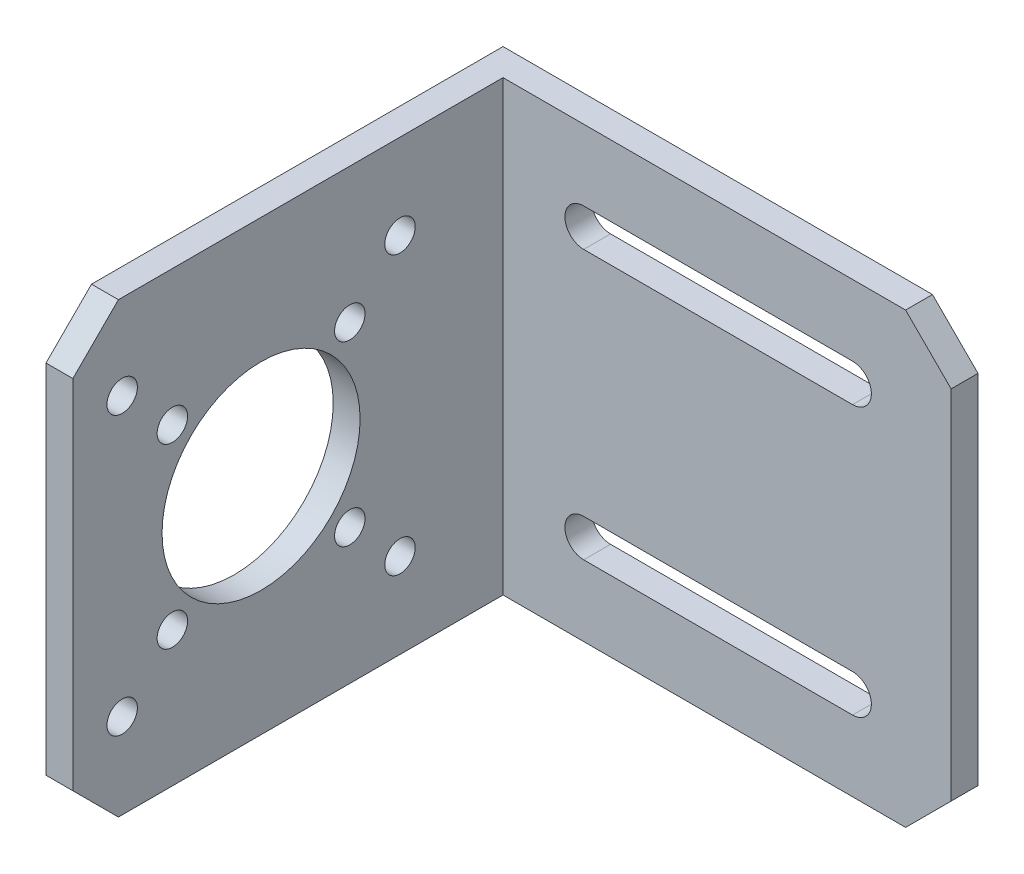
ISO-10303-21;
HEADER;
FILE_DESCRIPTION(('STEP AP214'),'2;1');
FILE_NAME('part.step','',(''),(''),'','','');
FILE_SCHEMA(('AUTOMOTIVE_DESIGN { 1 0 10303 214 1 1 1 1 }'));
ENDSEC;
DATA;
#1=APPLICATION_CONTEXT('core data for automotive mechanical design processes');
#2=APPLICATION_PROTOCOL_DEFINITION('international standard','automotive_design',2000,#1);
#3=PRODUCT_CONTEXT('',#1,'mechanical');
#4=PRODUCT('Part','Part','',(#3));
#5=PRODUCT_RELATED_PRODUCT_CATEGORY('part','',(#4));
#6=PRODUCT_DEFINITION_FORMATION('','',#4);
#7=PRODUCT_DEFINITION_CONTEXT('part definition',#1,'design');
#8=PRODUCT_DEFINITION('design','',#6,#7);
#9=PRODUCT_DEFINITION_SHAPE('','',#8);
#10=(LENGTH_UNIT() NAMED_UNIT(*) SI_UNIT(.MILLI.,.METRE.));
#11=(NAMED_UNIT(*) PLANE_ANGLE_UNIT() SI_UNIT($,.RADIAN.));
#12=(NAMED_UNIT(*) SI_UNIT($,.STERADIAN.) SOLID_ANGLE_UNIT());
#13=UNCERTAINTY_MEASURE_WITH_UNIT(LENGTH_MEASURE(1.E-05),#10,'distance_accuracy_value','');
#14=(GEOMETRIC_REPRESENTATION_CONTEXT(3) GLOBAL_UNCERTAINTY_ASSIGNED_CONTEXT((#13)) GLOBAL_UNIT_ASSIGNED_CONTEXT((#10,
#11,#12)) REPRESENTATION_CONTEXT('',''));
#15=CARTESIAN_POINT('',(0.,0.,0.));
#16=DIRECTION('',(0.,0.,1.));
#17=DIRECTION('',(1.,0.,0.));
#18=AXIS2_PLACEMENT_3D('',#15,#16,#17);
#19=CARTESIAN_POINT('',(0.,0.,3.));
#20=DIRECTION('',(0.,0.,-1.));
#21=DIRECTION('',(-1.,0.,0.));
#22=AXIS2_PLACEMENT_3D('',#19,#20,#21);
#23=PLANE('',#22);
#24=DIRECTION('',(-1.,0.,0.));
#25=VECTOR('',#24,1.);
#26=CARTESIAN_POINT('',(42.,42.1,3.));
#27=LINE('',#26,#25);
#28=CARTESIAN_POINT('',(42.,42.1,3.));
#29=VERTEX_POINT('',#28);
#30=CARTESIAN_POINT('',(12.,42.1,3.));
#31=VERTEX_POINT('',#30);
#32=EDGE_CURVE('E243',#29,#31,#27,.T.);
#33=ORIENTED_EDGE('',*,*,#32,.F.);
#34=CARTESIAN_POINT('',(42.,40.,3.));
#35=DIRECTION('',(0.,0.,1.));
#36=DIRECTION('',(1.,0.,0.));
#37=AXIS2_PLACEMENT_3D('',#34,#35,#36);
#38=CIRCLE('',#37,2.09999999999999);
#39=CARTESIAN_POINT('',(42.,37.9,3.));
#40=VERTEX_POINT('',#39);
#41=EDGE_CURVE('E221',#40,#29,#38,.T.);
#42=ORIENTED_EDGE('',*,*,#41,.F.);
#43=DIRECTION('',(1.,0.,0.));
#44=VECTOR('',#43,1.);
#45=CARTESIAN_POINT('',(42.,37.9,3.));
#46=LINE('',#45,#44);
#47=CARTESIAN_POINT('',(12.,37.9,3.));
#48=VERTEX_POINT('',#47);
#49=EDGE_CURVE('E232',#48,#40,#46,.T.);
#50=ORIENTED_EDGE('',*,*,#49,.F.);
#51=CARTESIAN_POINT('',(12.,40.,3.));
#52=DIRECTION('',(0.,0.,1.));
#53=DIRECTION('',(1.,0.,0.));
#54=AXIS2_PLACEMENT_3D('',#51,#52,#53);
#55=CIRCLE('',#54,2.09999999999999);
#56=EDGE_CURVE('E246',#31,#48,#55,.T.);
#57=ORIENTED_EDGE('',*,*,#56,.F.);
#58=EDGE_LOOP('',(#33,#42,#50,#57));
#59=FACE_BOUND('',#58,.T.);
#60=DIRECTION('',(-1.,0.,0.));
#61=VECTOR('',#60,1.);
#62=CARTESIAN_POINT('',(42.,12.1,3.));
#63=LINE('',#62,#61);
#64=CARTESIAN_POINT('',(42.,12.1,3.));
#65=VERTEX_POINT('',#64);
#66=CARTESIAN_POINT('',(12.,12.1,3.));
#67=VERTEX_POINT('',#66);
#68=EDGE_CURVE('E211',#65,#67,#63,.T.);
#69=ORIENTED_EDGE('',*,*,#68,.F.);
#70=CARTESIAN_POINT('',(42.,10.,3.));
#71=DIRECTION('',(0.,0.,1.));
#72=DIRECTION('',(-1.,0.,0.));
#73=AXIS2_PLACEMENT_3D('',#70,#71,#72);
#74=CIRCLE('',#73,2.09999999999999);
#75=CARTESIAN_POINT('',(42.,7.90000000000002,3.));
#76=VERTEX_POINT('',#75);
#77=EDGE_CURVE('E195',#76,#65,#74,.T.);
#78=ORIENTED_EDGE('',*,*,#77,.F.);
#79=DIRECTION('',(1.,0.,0.));
#80=VECTOR('',#79,1.);
#81=CARTESIAN_POINT('',(42.,7.90000000000002,3.));
#82=LINE('',#81,#80);
#83=CARTESIAN_POINT('',(12.,7.90000000000001,3.));
#84=VERTEX_POINT('',#83);
#85=EDGE_CURVE('E200',#84,#76,#82,.T.);
#86=ORIENTED_EDGE('',*,*,#85,.F.);
#87=CARTESIAN_POINT('',(12.,10.,3.));
#88=DIRECTION('',(0.,0.,1.));
#89=DIRECTION('',(-1.,0.,0.));
#90=AXIS2_PLACEMENT_3D('',#87,#88,#89);
#91=CIRCLE('',#90,2.09999999999999);
#92=EDGE_CURVE('E214',#67,#84,#91,.T.);
#93=ORIENTED_EDGE('',*,*,#92,.F.);
#94=EDGE_LOOP('',(#69,#78,#86,#93));
#95=FACE_BOUND('',#94,.T.);
#96=DIRECTION('',(1.,0.,0.));
#97=VECTOR('',#96,1.);
#98=CARTESIAN_POINT('',(0.,0.,3.));
#99=LINE('',#98,#97);
#100=CARTESIAN_POINT('',(3.,0.,3.));
#101=VERTEX_POINT('',#100);
#102=CARTESIAN_POINT('',(47.92,0.,3.));
#103=VERTEX_POINT('',#102);
#104=EDGE_CURVE('E260',#101,#103,#99,.T.);
#105=ORIENTED_EDGE('',*,*,#104,.T.);
#106=DIRECTION('',(-0.707106781186548,-0.707106781186547,0.));
#107=VECTOR('',#106,1.);
#108=CARTESIAN_POINT('',(53.,5.08,3.));
#109=LINE('',#108,#107);
#110=CARTESIAN_POINT('',(53.,5.08,3.));
#111=VERTEX_POINT('',#110);
#112=EDGE_CURVE('E11',#103,#111,#109,.F.);
#113=ORIENTED_EDGE('',*,*,#112,.T.);
#114=DIRECTION('',(0.,1.,0.));
#115=VECTOR('',#114,1.);
#116=CARTESIAN_POINT('',(53.,0.,3.));
#117=LINE('',#116,#115);
#118=CARTESIAN_POINT('',(53.,44.92,3.));
#119=VERTEX_POINT('',#118);
#120=EDGE_CURVE('E169',#111,#119,#117,.T.);
#121=ORIENTED_EDGE('',*,*,#120,.T.);
#122=DIRECTION('',(0.707106781186546,-0.70710678118655,0.));
#123=VECTOR('',#122,1.);
#124=CARTESIAN_POINT('',(47.92,50.,3.));
#125=LINE('',#124,#123);
#126=CARTESIAN_POINT('',(47.92,50.,3.));
#127=VERTEX_POINT('',#126);
#128=EDGE_CURVE('E43',#119,#127,#125,.F.);
#129=ORIENTED_EDGE('',*,*,#128,.T.);
#130=DIRECTION('',(-1.,0.,0.));
#131=VECTOR('',#130,1.);
#132=CARTESIAN_POINT('',(0.,50.,3.));
#133=LINE('',#132,#131);
#134=CARTESIAN_POINT('',(3.,50.,3.));
#135=VERTEX_POINT('',#134);
#136=EDGE_CURVE('E159',#127,#135,#133,.T.);
#137=ORIENTED_EDGE('',*,*,#136,.T.);
#138=DIRECTION('',(0.,1.,0.));
#139=VECTOR('',#138,1.);
#140=CARTESIAN_POINT('',(3.,50.,3.));
#141=LINE('',#140,#139);
#142=EDGE_CURVE('E162',#101,#135,#141,.T.);
#143=ORIENTED_EDGE('',*,*,#142,.F.);
#144=EDGE_LOOP('',(#105,#113,#121,#129,#137,#143));
#145=FACE_BOUND('',#144,.T.);
#146=ADVANCED_FACE('F35',(#59,#95,#145),#23,.F.);
#147=CARTESIAN_POINT('',(0.,0.,3.));
#148=DIRECTION('',(1.,0.,0.));
#149=DIRECTION('',(0.,0.,-1.));
#150=AXIS2_PLACEMENT_3D('',#147,#148,#149);
#151=PLANE('',#150);
#152=CARTESIAN_POINT('',(0.,15.1005050633883,39.8994949366117));
#153=DIRECTION('',(-1.,0.,0.));
#154=DIRECTION('',(0.,0.,1.));
#155=AXIS2_PLACEMENT_3D('',#152,#153,#154);
#156=CIRCLE('',#155,1.69999999999999);
#157=CARTESIAN_POINT('',(0.,15.1005050633883,41.5994949366116));
#158=VERTEX_POINT('',#157);
#159=EDGE_CURVE('E684',#158,#158,#156,.T.);
#160=ORIENTED_EDGE('',*,*,#159,.F.);
#161=EDGE_LOOP('',(#160));
#162=FACE_BOUND('',#161,.T.);
#163=CARTESIAN_POINT('',(0.,34.8994949366117,20.1005050633883));
#164=DIRECTION('',(-1.,0.,0.));
#165=DIRECTION('',(0.,0.,1.));
#166=AXIS2_PLACEMENT_3D('',#163,#164,#165);
#167=CIRCLE('',#166,1.69999999999999);
#168=CARTESIAN_POINT('',(0.,34.8994949366117,21.8005050633883));
#169=VERTEX_POINT('',#168);
#170=EDGE_CURVE('E688',#169,#169,#167,.T.);
#171=ORIENTED_EDGE('',*,*,#170,.F.);
#172=EDGE_LOOP('',(#171));
#173=FACE_BOUND('',#172,.T.);
#174=CARTESIAN_POINT('',(0.,15.1005050633883,20.1005050633883));
#175=DIRECTION('',(-1.,0.,0.));
#176=DIRECTION('',(0.,0.,1.));
#177=AXIS2_PLACEMENT_3D('',#174,#175,#176);
#178=CIRCLE('',#177,1.69999999999999);
#179=CARTESIAN_POINT('',(0.,15.1005050633883,21.8005050633883));
#180=VERTEX_POINT('',#179);
#181=EDGE_CURVE('E697',#180,#180,#178,.T.);
#182=ORIENTED_EDGE('',*,*,#181,.F.);
#183=EDGE_LOOP('',(#182));
#184=FACE_BOUND('',#183,.T.);
#185=CARTESIAN_POINT('',(0.,34.8994949366117,39.8994949366117));
#186=DIRECTION('',(-1.,0.,0.));
#187=DIRECTION('',(0.,0.,1.));
#188=AXIS2_PLACEMENT_3D('',#185,#186,#187);
#189=CIRCLE('',#188,1.69999999999999);
#190=CARTESIAN_POINT('',(0.,34.8994949366117,41.5994949366116));
#191=VERTEX_POINT('',#190);
#192=EDGE_CURVE('E286',#191,#191,#189,.T.);
#193=ORIENTED_EDGE('',*,*,#192,.F.);
#194=EDGE_LOOP('',(#193));
#195=FACE_BOUND('',#194,.T.);
#196=CARTESIAN_POINT('',(0.,9.5,45.5));
#197=DIRECTION('',(-1.,0.,0.));
#198=DIRECTION('',(0.,0.,1.));
#199=AXIS2_PLACEMENT_3D('',#196,#197,#198);
#200=CIRCLE('',#199,1.69999999999999);
#201=CARTESIAN_POINT('',(0.,9.5,47.2));
#202=VERTEX_POINT('',#201);
#203=EDGE_CURVE('E285',#202,#202,#200,.T.);
#204=ORIENTED_EDGE('',*,*,#203,.F.);
#205=EDGE_LOOP('',(#204));
#206=FACE_BOUND('',#205,.T.);
#207=CARTESIAN_POINT('',(0.,40.5,14.5));
#208=DIRECTION('',(-1.,0.,0.));
#209=DIRECTION('',(0.,0.,1.));
#210=AXIS2_PLACEMENT_3D('',#207,#208,#209);
#211=CIRCLE('',#210,1.69999999999999);
#212=CARTESIAN_POINT('',(0.,40.5,16.2));
#213=VERTEX_POINT('',#212);
#214=EDGE_CURVE('E710',#213,#213,#211,.T.);
#215=ORIENTED_EDGE('',*,*,#214,.F.);
#216=EDGE_LOOP('',(#215));
#217=FACE_BOUND('',#216,.T.);
#218=CARTESIAN_POINT('',(0.,9.5,14.5));
#219=DIRECTION('',(-1.,0.,0.));
#220=DIRECTION('',(0.,0.,1.));
#221=AXIS2_PLACEMENT_3D('',#218,#219,#220);
#222=CIRCLE('',#221,1.69999999999999);
#223=CARTESIAN_POINT('',(0.,9.5,16.2));
#224=VERTEX_POINT('',#223);
#225=EDGE_CURVE('E281',#224,#224,#222,.T.);
#226=ORIENTED_EDGE('',*,*,#225,.F.);
#227=EDGE_LOOP('',(#226));
#228=FACE_BOUND('',#227,.T.);
#229=CARTESIAN_POINT('',(0.,40.5,45.5));
#230=DIRECTION('',(-1.,0.,0.));
#231=DIRECTION('',(0.,0.,1.));
#232=AXIS2_PLACEMENT_3D('',#229,#230,#231);
#233=CIRCLE('',#232,1.69999999999999);
#234=CARTESIAN_POINT('',(0.,40.5,47.2));
#235=VERTEX_POINT('',#234);
#236=EDGE_CURVE('E280',#235,#235,#233,.T.);
#237=ORIENTED_EDGE('',*,*,#236,.F.);
#238=EDGE_LOOP('',(#237));
#239=FACE_BOUND('',#238,.T.);
#240=CARTESIAN_POINT('',(0.,25.,30.));
#241=DIRECTION('',(-1.,0.,0.));
#242=DIRECTION('',(0.,0.,1.));
#243=AXIS2_PLACEMENT_3D('',#240,#241,#242);
#244=CIRCLE('',#243,11.05);
#245=CARTESIAN_POINT('',(0.,25.,41.05));
#246=VERTEX_POINT('',#245);
#247=EDGE_CURVE('E190',#246,#246,#244,.T.);
#248=ORIENTED_EDGE('',*,*,#247,.F.);
#249=EDGE_LOOP('',(#248));
#250=FACE_BOUND('',#249,.T.);
#251=DIRECTION('',(0.,-1.,0.));
#252=VECTOR('',#251,1.);
#253=CARTESIAN_POINT('',(0.,50.,51.));
#254=LINE('',#253,#252);
#255=CARTESIAN_POINT('',(0.,44.92,51.));
#256=VERTEX_POINT('',#255);
#257=CARTESIAN_POINT('',(0.,5.08,51.));
#258=VERTEX_POINT('',#257);
#259=EDGE_CURVE('E184',#256,#258,#254,.T.);
#260=ORIENTED_EDGE('',*,*,#259,.F.);
#261=DIRECTION('',(0.,0.707106781186546,-0.707106781186549));
#262=VECTOR('',#261,1.);
#263=CARTESIAN_POINT('',(0.,44.92,51.));
#264=LINE('',#263,#262);
#265=CARTESIAN_POINT('',(0.,50.,45.92));
#266=VERTEX_POINT('',#265);
#267=EDGE_CURVE('E294',#256,#266,#264,.T.);
#268=ORIENTED_EDGE('',*,*,#267,.T.);
#269=DIRECTION('',(0.,0.,-1.));
#270=VECTOR('',#269,1.);
#271=CARTESIAN_POINT('',(0.,50.,3.));
#272=LINE('',#271,#270);
#273=CARTESIAN_POINT('',(0.,50.,0.));
#274=VERTEX_POINT('',#273);
#275=EDGE_CURVE('E168',#266,#274,#272,.T.);
#276=ORIENTED_EDGE('',*,*,#275,.T.);
#277=DIRECTION('',(0.,-1.,0.));
#278=VECTOR('',#277,1.);
#279=CARTESIAN_POINT('',(0.,0.,0.));
#280=LINE('',#279,#278);
#281=CARTESIAN_POINT('',(0.,0.,0.));
#282=VERTEX_POINT('',#281);
#283=EDGE_CURVE('E253',#274,#282,#280,.T.);
#284=ORIENTED_EDGE('',*,*,#283,.T.);
#285=DIRECTION('',(0.,0.,-1.));
#286=VECTOR('',#285,1.);
#287=CARTESIAN_POINT('',(0.,0.,3.));
#288=LINE('',#287,#286);
#289=CARTESIAN_POINT('',(0.,0.,45.92));
#290=VERTEX_POINT('',#289);
#291=EDGE_CURVE('E274',#290,#282,#288,.T.);
#292=ORIENTED_EDGE('',*,*,#291,.F.);
#293=DIRECTION('',(0.,0.707106781186547,0.707106781186548));
#294=VECTOR('',#293,1.);
#295=CARTESIAN_POINT('',(0.,5.08,51.));
#296=LINE('',#295,#294);
#297=EDGE_CURVE('E292',#290,#258,#296,.T.);
#298=ORIENTED_EDGE('',*,*,#297,.T.);
#299=EDGE_LOOP('',(#260,#268,#276,#284,#292,#298));
#300=FACE_BOUND('',#299,.T.);
#301=ADVANCED_FACE('F331',(#162,#173,#184,#195,#206,#217,#228,#239,#250,#300),#151,.F.);
#302=CARTESIAN_POINT('',(0.,0.,3.));
#303=DIRECTION('',(0.,1.,0.));
#304=DIRECTION('',(0.,0.,1.));
#305=AXIS2_PLACEMENT_3D('',#302,#303,#304);
#306=PLANE('',#305);
#307=DIRECTION('',(0.,0.,-1.));
#308=VECTOR('',#307,1.);
#309=CARTESIAN_POINT('',(3.00000000000001,0.,51.));
#310=LINE('',#309,#308);
#311=CARTESIAN_POINT('',(3.00000000000001,0.,45.92));
#312=VERTEX_POINT('',#311);
#313=EDGE_CURVE('E179',#312,#101,#310,.T.);
#314=ORIENTED_EDGE('',*,*,#313,.F.);
#315=DIRECTION('',(-1.,0.,0.));
#316=VECTOR('',#315,1.);
#317=CARTESIAN_POINT('',(0.,0.,45.92));
#318=LINE('',#317,#316);
#319=EDGE_CURVE('E305',#312,#290,#318,.T.);
#320=ORIENTED_EDGE('',*,*,#319,.T.);
#321=ORIENTED_EDGE('',*,*,#291,.T.);
#322=DIRECTION('',(1.,0.,0.));
#323=VECTOR('',#322,1.);
#324=CARTESIAN_POINT('',(0.,0.,0.));
#325=LINE('',#324,#323);
#326=CARTESIAN_POINT('',(47.92,0.,0.));
#327=VERTEX_POINT('',#326);
#328=EDGE_CURVE('E266',#282,#327,#325,.T.);
#329=ORIENTED_EDGE('',*,*,#328,.T.);
#330=DIRECTION('',(0.,0.,1.));
#331=VECTOR('',#330,1.);
#332=CARTESIAN_POINT('',(47.92,0.,3.));
#333=LINE('',#332,#331);
#334=EDGE_CURVE('E303',#327,#103,#333,.T.);
#335=ORIENTED_EDGE('',*,*,#334,.T.);
#336=ORIENTED_EDGE('',*,*,#104,.F.);
#337=EDGE_LOOP('',(#314,#320,#321,#329,#335,#336));
#338=FACE_BOUND('',#337,.T.);
#339=ADVANCED_FACE('F323',(#338),#306,.F.);
#340=CARTESIAN_POINT('',(53.,0.,3.));
#341=DIRECTION('',(-1.,0.,0.));
#342=DIRECTION('',(0.,0.,1.));
#343=AXIS2_PLACEMENT_3D('',#340,#341,#342);
#344=PLANE('',#343);
#345=ORIENTED_EDGE('',*,*,#120,.F.);
#346=DIRECTION('',(0.,0.,-1.));
#347=VECTOR('',#346,1.);
#348=CARTESIAN_POINT('',(53.,5.08,3.));
#349=LINE('',#348,#347);
#350=CARTESIAN_POINT('',(53.,5.08,0.));
#351=VERTEX_POINT('',#350);
#352=EDGE_CURVE('E308',#111,#351,#349,.T.);
#353=ORIENTED_EDGE('',*,*,#352,.T.);
#354=DIRECTION('',(0.,1.,0.));
#355=VECTOR('',#354,1.);
#356=CARTESIAN_POINT('',(53.,0.,0.));
#357=LINE('',#356,#355);
#358=CARTESIAN_POINT('',(53.,44.92,0.));
#359=VERTEX_POINT('',#358);
#360=EDGE_CURVE('E269',#351,#359,#357,.T.);
#361=ORIENTED_EDGE('',*,*,#360,.T.);
#362=DIRECTION('',(0.,0.,1.));
#363=VECTOR('',#362,1.);
#364=CARTESIAN_POINT('',(53.,44.92,3.));
#365=LINE('',#364,#363);
#366=EDGE_CURVE('E50',#359,#119,#365,.T.);
#367=ORIENTED_EDGE('',*,*,#366,.T.);
#368=EDGE_LOOP('',(#345,#353,#361,#367));
#369=FACE_BOUND('',#368,.T.);
#370=ADVANCED_FACE('F326',(#369),#344,.F.);
#371=CARTESIAN_POINT('',(0.,50.,3.));
#372=DIRECTION('',(0.,-1.,0.));
#373=DIRECTION('',(0.,0.,-1.));
#374=AXIS2_PLACEMENT_3D('',#371,#372,#373);
#375=PLANE('',#374);
#376=ORIENTED_EDGE('',*,*,#275,.F.);
#377=DIRECTION('',(1.,0.,0.));
#378=VECTOR('',#377,1.);
#379=CARTESIAN_POINT('',(3.,50.,45.92));
#380=LINE('',#379,#378);
#381=CARTESIAN_POINT('',(3.,50.,45.92));
#382=VERTEX_POINT('',#381);
#383=EDGE_CURVE('E176',#266,#382,#380,.T.);
#384=ORIENTED_EDGE('',*,*,#383,.T.);
#385=DIRECTION('',(0.,0.,-1.));
#386=VECTOR('',#385,1.);
#387=CARTESIAN_POINT('',(3.,50.,51.));
#388=LINE('',#387,#386);
#389=EDGE_CURVE('E172',#382,#135,#388,.T.);
#390=ORIENTED_EDGE('',*,*,#389,.T.);
#391=ORIENTED_EDGE('',*,*,#136,.F.);
#392=DIRECTION('',(0.,0.,-1.));
#393=VECTOR('',#392,1.);
#394=CARTESIAN_POINT('',(47.92,50.,3.));
#395=LINE('',#394,#393);
#396=CARTESIAN_POINT('',(47.92,50.,0.));
#397=VERTEX_POINT('',#396);
#398=EDGE_CURVE('E296',#127,#397,#395,.T.);
#399=ORIENTED_EDGE('',*,*,#398,.T.);
#400=DIRECTION('',(-1.,0.,0.));
#401=VECTOR('',#400,1.);
#402=CARTESIAN_POINT('',(0.,50.,0.));
#403=LINE('',#402,#401);
#404=EDGE_CURVE('E262',#397,#274,#403,.T.);
#405=ORIENTED_EDGE('',*,*,#404,.T.);
#406=EDGE_LOOP('',(#376,#384,#390,#391,#399,#405));
#407=FACE_BOUND('',#406,.T.);
#408=ADVANCED_FACE('F174',(#407),#375,.F.);
#409=CARTESIAN_POINT('',(0.,0.,0.));
#410=DIRECTION('',(0.,0.,-1.));
#411=DIRECTION('',(-1.,0.,0.));
#412=AXIS2_PLACEMENT_3D('',#409,#410,#411);
#413=PLANE('',#412);
#414=CARTESIAN_POINT('',(42.,10.,0.));
#415=DIRECTION('',(0.,0.,1.));
#416=DIRECTION('',(-1.,0.,0.));
#417=AXIS2_PLACEMENT_3D('',#414,#415,#416);
#418=CIRCLE('',#417,2.09999999999999);
#419=CARTESIAN_POINT('',(42.,7.90000000000002,0.));
#420=VERTEX_POINT('',#419);
#421=CARTESIAN_POINT('',(42.,12.1,0.));
#422=VERTEX_POINT('',#421);
#423=EDGE_CURVE('E196',#420,#422,#418,.T.);
#424=ORIENTED_EDGE('',*,*,#423,.T.);
#425=DIRECTION('',(-1.,0.,0.));
#426=VECTOR('',#425,1.);
#427=CARTESIAN_POINT('',(42.,12.1,0.));
#428=LINE('',#427,#426);
#429=CARTESIAN_POINT('',(12.,12.1,0.));
#430=VERTEX_POINT('',#429);
#431=EDGE_CURVE('E199',#422,#430,#428,.T.);
#432=ORIENTED_EDGE('',*,*,#431,.T.);
#433=CARTESIAN_POINT('',(12.,10.,0.));
#434=DIRECTION('',(0.,0.,1.));
#435=DIRECTION('',(-1.,0.,0.));
#436=AXIS2_PLACEMENT_3D('',#433,#434,#435);
#437=CIRCLE('',#436,2.09999999999999);
#438=CARTESIAN_POINT('',(12.,7.90000000000001,0.));
#439=VERTEX_POINT('',#438);
#440=EDGE_CURVE('E203',#430,#439,#437,.T.);
#441=ORIENTED_EDGE('',*,*,#440,.T.);
#442=DIRECTION('',(1.,0.,0.));
#443=VECTOR('',#442,1.);
#444=CARTESIAN_POINT('',(42.,7.90000000000002,0.));
#445=LINE('',#444,#443);
#446=EDGE_CURVE('E206',#439,#420,#445,.T.);
#447=ORIENTED_EDGE('',*,*,#446,.T.);
#448=EDGE_LOOP('',(#424,#432,#441,#447));
#449=FACE_BOUND('',#448,.T.);
#450=CARTESIAN_POINT('',(42.,40.,0.));
#451=DIRECTION('',(0.,0.,1.));
#452=DIRECTION('',(1.,0.,0.));
#453=AXIS2_PLACEMENT_3D('',#450,#451,#452);
#454=CIRCLE('',#453,2.09999999999999);
#455=CARTESIAN_POINT('',(42.,37.9,0.));
#456=VERTEX_POINT('',#455);
#457=CARTESIAN_POINT('',(42.,42.1,0.));
#458=VERTEX_POINT('',#457);
#459=EDGE_CURVE('E228',#456,#458,#454,.T.);
#460=ORIENTED_EDGE('',*,*,#459,.T.);
#461=DIRECTION('',(-1.,0.,0.));
#462=VECTOR('',#461,1.);
#463=CARTESIAN_POINT('',(42.,42.1,0.));
#464=LINE('',#463,#462);
#465=CARTESIAN_POINT('',(12.,42.1,0.));
#466=VERTEX_POINT('',#465);
#467=EDGE_CURVE('E231',#458,#466,#464,.T.);
#468=ORIENTED_EDGE('',*,*,#467,.T.);
#469=CARTESIAN_POINT('',(12.,40.,0.));
#470=DIRECTION('',(0.,0.,1.));
#471=DIRECTION('',(1.,0.,0.));
#472=AXIS2_PLACEMENT_3D('',#469,#470,#471);
#473=CIRCLE('',#472,2.09999999999999);
#474=CARTESIAN_POINT('',(12.,37.9,0.));
#475=VERTEX_POINT('',#474);
#476=EDGE_CURVE('E235',#466,#475,#473,.T.);
#477=ORIENTED_EDGE('',*,*,#476,.T.);
#478=DIRECTION('',(1.,0.,0.));
#479=VECTOR('',#478,1.);
#480=CARTESIAN_POINT('',(42.,37.9,0.));
#481=LINE('',#480,#479);
#482=EDGE_CURVE('E238',#475,#456,#481,.T.);
#483=ORIENTED_EDGE('',*,*,#482,.T.);
#484=EDGE_LOOP('',(#460,#468,#477,#483));
#485=FACE_BOUND('',#484,.T.);
#486=ORIENTED_EDGE('',*,*,#360,.F.);
#487=DIRECTION('',(0.707106781186548,0.707106781186547,0.));
#488=VECTOR('',#487,1.);
#489=CARTESIAN_POINT('',(23.9599999999999,-23.96,0.));
#490=LINE('',#489,#488);
#491=EDGE_CURVE('E313',#351,#327,#490,.F.);
#492=ORIENTED_EDGE('',*,*,#491,.T.);
#493=ORIENTED_EDGE('',*,*,#328,.F.);
#494=ORIENTED_EDGE('',*,*,#283,.F.);
#495=ORIENTED_EDGE('',*,*,#404,.F.);
#496=DIRECTION('',(-0.707106781186546,0.70710678118655,0.));
#497=VECTOR('',#496,1.);
#498=CARTESIAN_POINT('',(48.9600000000001,48.9599999999999,0.));
#499=LINE('',#498,#497);
#500=EDGE_CURVE('E311',#397,#359,#499,.F.);
#501=ORIENTED_EDGE('',*,*,#500,.T.);
#502=EDGE_LOOP('',(#486,#492,#493,#494,#495,#501));
#503=FACE_BOUND('',#502,.T.);
#504=ADVANCED_FACE('F317',(#449,#485,#503),#413,.T.);
#505=CARTESIAN_POINT('',(42.,40.,0.));
#506=DIRECTION('',(0.,0.,1.));
#507=DIRECTION('',(1.,0.,0.));
#508=AXIS2_PLACEMENT_3D('',#505,#506,#507);
#509=CYLINDRICAL_SURFACE('',#508,2.09999999999999);
#510=ORIENTED_EDGE('',*,*,#41,.T.);
#511=DIRECTION('',(0.,0.,1.));
#512=VECTOR('',#511,1.);
#513=CARTESIAN_POINT('',(42.,42.1,0.));
#514=LINE('',#513,#512);
#515=EDGE_CURVE('E241',#458,#29,#514,.T.);
#516=ORIENTED_EDGE('',*,*,#515,.F.);
#517=ORIENTED_EDGE('',*,*,#459,.F.);
#518=DIRECTION('',(0.,0.,1.));
#519=VECTOR('',#518,1.);
#520=CARTESIAN_POINT('',(42.,37.9,0.));
#521=LINE('',#520,#519);
#522=EDGE_CURVE('E251',#456,#40,#521,.T.);
#523=ORIENTED_EDGE('',*,*,#522,.T.);
#524=EDGE_LOOP('',(#510,#516,#517,#523));
#525=FACE_BOUND('',#524,.T.);
#526=ADVANCED_FACE('F364',(#525),#509,.F.);
#527=CARTESIAN_POINT('',(42.,37.9,0.));
#528=DIRECTION('',(0.,-1.,0.));
#529=DIRECTION('',(1.,0.,0.));
#530=AXIS2_PLACEMENT_3D('',#527,#528,#529);
#531=PLANE('',#530);
#532=ORIENTED_EDGE('',*,*,#49,.T.);
#533=ORIENTED_EDGE('',*,*,#522,.F.);
#534=ORIENTED_EDGE('',*,*,#482,.F.);
#535=DIRECTION('',(0.,0.,1.));
#536=VECTOR('',#535,1.);
#537=CARTESIAN_POINT('',(12.,37.9,0.));
#538=LINE('',#537,#536);
#539=EDGE_CURVE('E254',#475,#48,#538,.T.);
#540=ORIENTED_EDGE('',*,*,#539,.T.);
#541=EDGE_LOOP('',(#532,#533,#534,#540));
#542=FACE_BOUND('',#541,.T.);
#543=ADVANCED_FACE('F396',(#542),#531,.F.);
#544=CARTESIAN_POINT('',(12.,40.,0.));
#545=DIRECTION('',(0.,0.,1.));
#546=DIRECTION('',(1.,0.,0.));
#547=AXIS2_PLACEMENT_3D('',#544,#545,#546);
#548=CYLINDRICAL_SURFACE('',#547,2.09999999999999);
#549=ORIENTED_EDGE('',*,*,#56,.T.);
#550=ORIENTED_EDGE('',*,*,#539,.F.);
#551=ORIENTED_EDGE('',*,*,#476,.F.);
#552=DIRECTION('',(0.,0.,1.));
#553=VECTOR('',#552,1.);
#554=CARTESIAN_POINT('',(12.,42.1,0.));
#555=LINE('',#554,#553);
#556=EDGE_CURVE('E256',#466,#31,#555,.T.);
#557=ORIENTED_EDGE('',*,*,#556,.T.);
#558=EDGE_LOOP('',(#549,#550,#551,#557));
#559=FACE_BOUND('',#558,.T.);
#560=ADVANCED_FACE('F403',(#559),#548,.F.);
#561=CARTESIAN_POINT('',(42.,42.1,0.));
#562=DIRECTION('',(0.,1.,0.));
#563=DIRECTION('',(0.,0.,1.));
#564=AXIS2_PLACEMENT_3D('',#561,#562,#563);
#565=PLANE('',#564);
#566=ORIENTED_EDGE('',*,*,#32,.T.);
#567=ORIENTED_EDGE('',*,*,#556,.F.);
#568=ORIENTED_EDGE('',*,*,#467,.F.);
#569=ORIENTED_EDGE('',*,*,#515,.T.);
#570=EDGE_LOOP('',(#566,#567,#568,#569));
#571=FACE_BOUND('',#570,.T.);
#572=ADVANCED_FACE('F411',(#571),#565,.F.);
#573=CARTESIAN_POINT('',(42.,10.,0.));
#574=DIRECTION('',(0.,0.,1.));
#575=DIRECTION('',(1.,0.,0.));
#576=AXIS2_PLACEMENT_3D('',#573,#574,#575);
#577=CYLINDRICAL_SURFACE('',#576,2.09999999999999);
#578=ORIENTED_EDGE('',*,*,#77,.T.);
#579=DIRECTION('',(0.,0.,1.));
#580=VECTOR('',#579,1.);
#581=CARTESIAN_POINT('',(42.,12.1,0.));
#582=LINE('',#581,#580);
#583=EDGE_CURVE('E209',#422,#65,#582,.T.);
#584=ORIENTED_EDGE('',*,*,#583,.F.);
#585=ORIENTED_EDGE('',*,*,#423,.F.);
#586=DIRECTION('',(0.,0.,1.));
#587=VECTOR('',#586,1.);
#588=CARTESIAN_POINT('',(42.,7.90000000000002,0.));
#589=LINE('',#588,#587);
#590=EDGE_CURVE('E219',#420,#76,#589,.T.);
#591=ORIENTED_EDGE('',*,*,#590,.T.);
#592=EDGE_LOOP('',(#578,#584,#585,#591));
#593=FACE_BOUND('',#592,.T.);
#594=ADVANCED_FACE('F419',(#593),#577,.F.);
#595=CARTESIAN_POINT('',(42.,7.90000000000002,0.));
#596=DIRECTION('',(0.,-1.,0.));
#597=DIRECTION('',(0.,0.,-1.));
#598=AXIS2_PLACEMENT_3D('',#595,#596,#597);
#599=PLANE('',#598);
#600=ORIENTED_EDGE('',*,*,#85,.T.);
#601=ORIENTED_EDGE('',*,*,#590,.F.);
#602=ORIENTED_EDGE('',*,*,#446,.F.);
#603=DIRECTION('',(0.,0.,1.));
#604=VECTOR('',#603,1.);
#605=CARTESIAN_POINT('',(12.,7.90000000000001,0.));
#606=LINE('',#605,#604);
#607=EDGE_CURVE('E222',#439,#84,#606,.T.);
#608=ORIENTED_EDGE('',*,*,#607,.T.);
#609=EDGE_LOOP('',(#600,#601,#602,#608));
#610=FACE_BOUND('',#609,.T.);
#611=ADVANCED_FACE('F426',(#610),#599,.F.);
#612=CARTESIAN_POINT('',(12.,10.,0.));
#613=DIRECTION('',(0.,0.,1.));
#614=DIRECTION('',(1.,0.,0.));
#615=AXIS2_PLACEMENT_3D('',#612,#613,#614);
#616=CYLINDRICAL_SURFACE('',#615,2.09999999999999);
#617=ORIENTED_EDGE('',*,*,#92,.T.);
#618=ORIENTED_EDGE('',*,*,#607,.F.);
#619=ORIENTED_EDGE('',*,*,#440,.F.);
#620=DIRECTION('',(0.,0.,1.));
#621=VECTOR('',#620,1.);
#622=CARTESIAN_POINT('',(12.,12.1,0.));
#623=LINE('',#622,#621);
#624=EDGE_CURVE('E224',#430,#67,#623,.T.);
#625=ORIENTED_EDGE('',*,*,#624,.T.);
#626=EDGE_LOOP('',(#617,#618,#619,#625));
#627=FACE_BOUND('',#626,.T.);
#628=ADVANCED_FACE('F434',(#627),#616,.F.);
#629=CARTESIAN_POINT('',(42.,12.1,0.));
#630=DIRECTION('',(0.,1.,0.));
#631=DIRECTION('',(-1.,0.,0.));
#632=AXIS2_PLACEMENT_3D('',#629,#630,#631);
#633=PLANE('',#632);
#634=ORIENTED_EDGE('',*,*,#68,.T.);
#635=ORIENTED_EDGE('',*,*,#624,.F.);
#636=ORIENTED_EDGE('',*,*,#431,.F.);
#637=ORIENTED_EDGE('',*,*,#583,.T.);
#638=EDGE_LOOP('',(#634,#635,#636,#637));
#639=FACE_BOUND('',#638,.T.);
#640=ADVANCED_FACE('F442',(#639),#633,.F.);
#641=CARTESIAN_POINT('',(3.,50.,51.));
#642=DIRECTION('',(-1.,0.,0.));
#643=DIRECTION('',(0.,-1.,0.));
#644=AXIS2_PLACEMENT_3D('',#641,#642,#643);
#645=PLANE('',#644);
#646=CARTESIAN_POINT('',(3.,15.1005050633883,39.8994949366117));
#647=DIRECTION('',(-1.,0.,0.));
#648=DIRECTION('',(0.,-1.,0.));
#649=AXIS2_PLACEMENT_3D('',#646,#647,#648);
#650=CIRCLE('',#649,1.69999999999999);
#651=CARTESIAN_POINT('',(3.,13.4005050633883,39.8994949366117));
#652=VERTEX_POINT('',#651);
#653=EDGE_CURVE('E687',#652,#652,#650,.T.);
#654=ORIENTED_EDGE('',*,*,#653,.T.);
#655=EDGE_LOOP('',(#654));
#656=FACE_BOUND('',#655,.T.);
#657=CARTESIAN_POINT('',(3.,34.8994949366117,20.1005050633883));
#658=DIRECTION('',(-1.,0.,0.));
#659=DIRECTION('',(0.,-1.,0.));
#660=AXIS2_PLACEMENT_3D('',#657,#658,#659);
#661=CIRCLE('',#660,1.69999999999999);
#662=CARTESIAN_POINT('',(3.,33.1994949366117,20.1005050633883));
#663=VERTEX_POINT('',#662);
#664=EDGE_CURVE('E691',#663,#663,#661,.T.);
#665=ORIENTED_EDGE('',*,*,#664,.T.);
#666=EDGE_LOOP('',(#665));
#667=FACE_BOUND('',#666,.T.);
#668=CARTESIAN_POINT('',(3.,15.1005050633883,20.1005050633883));
#669=DIRECTION('',(-1.,0.,0.));
#670=DIRECTION('',(0.,-1.,0.));
#671=AXIS2_PLACEMENT_3D('',#668,#669,#670);
#672=CIRCLE('',#671,1.69999999999999);
#673=CARTESIAN_POINT('',(3.,13.4005050633883,20.1005050633883));
#674=VERTEX_POINT('',#673);
#675=EDGE_CURVE('E700',#674,#674,#672,.T.);
#676=ORIENTED_EDGE('',*,*,#675,.T.);
#677=EDGE_LOOP('',(#676));
#678=FACE_BOUND('',#677,.T.);
#679=CARTESIAN_POINT('',(3.,34.8994949366117,39.8994949366117));
#680=DIRECTION('',(-1.,0.,0.));
#681=DIRECTION('',(0.,-1.,0.));
#682=AXIS2_PLACEMENT_3D('',#679,#680,#681);
#683=CIRCLE('',#682,1.69999999999999);
#684=CARTESIAN_POINT('',(3.,33.1994949366117,39.8994949366117));
#685=VERTEX_POINT('',#684);
#686=EDGE_CURVE('E282',#685,#685,#683,.T.);
#687=ORIENTED_EDGE('',*,*,#686,.T.);
#688=EDGE_LOOP('',(#687));
#689=FACE_BOUND('',#688,.T.);
#690=CARTESIAN_POINT('',(3.,9.5,45.5));
#691=DIRECTION('',(-1.,0.,0.));
#692=DIRECTION('',(0.,-1.,0.));
#693=AXIS2_PLACEMENT_3D('',#690,#691,#692);
#694=CIRCLE('',#693,1.69999999999999);
#695=CARTESIAN_POINT('',(3.,7.80000000000001,45.5));
#696=VERTEX_POINT('',#695);
#697=EDGE_CURVE('E707',#696,#696,#694,.T.);
#698=ORIENTED_EDGE('',*,*,#697,.T.);
#699=EDGE_LOOP('',(#698));
#700=FACE_BOUND('',#699,.T.);
#701=CARTESIAN_POINT('',(3.,40.5,14.5));
#702=DIRECTION('',(-1.,0.,0.));
#703=DIRECTION('',(0.,-1.,0.));
#704=AXIS2_PLACEMENT_3D('',#701,#702,#703);
#705=CIRCLE('',#704,1.69999999999999);
#706=CARTESIAN_POINT('',(3.,38.8,14.5));
#707=VERTEX_POINT('',#706);
#708=EDGE_CURVE('E713',#707,#707,#705,.T.);
#709=ORIENTED_EDGE('',*,*,#708,.T.);
#710=EDGE_LOOP('',(#709));
#711=FACE_BOUND('',#710,.T.);
#712=CARTESIAN_POINT('',(3.,9.5,14.5));
#713=DIRECTION('',(-1.,0.,0.));
#714=DIRECTION('',(0.,-1.,0.));
#715=AXIS2_PLACEMENT_3D('',#712,#713,#714);
#716=CIRCLE('',#715,1.69999999999999);
#717=CARTESIAN_POINT('',(3.,7.80000000000001,14.5));
#718=VERTEX_POINT('',#717);
#719=EDGE_CURVE('E277',#718,#718,#716,.T.);
#720=ORIENTED_EDGE('',*,*,#719,.T.);
#721=EDGE_LOOP('',(#720));
#722=FACE_BOUND('',#721,.T.);
#723=CARTESIAN_POINT('',(3.,40.5,45.5));
#724=DIRECTION('',(-1.,0.,0.));
#725=DIRECTION('',(0.,-1.,0.));
#726=AXIS2_PLACEMENT_3D('',#723,#724,#725);
#727=CIRCLE('',#726,1.69999999999999);
#728=CARTESIAN_POINT('',(3.,38.8,45.5));
#729=VERTEX_POINT('',#728);
#730=EDGE_CURVE('E720',#729,#729,#727,.T.);
#731=ORIENTED_EDGE('',*,*,#730,.T.);
#732=EDGE_LOOP('',(#731));
#733=FACE_BOUND('',#732,.T.);
#734=CARTESIAN_POINT('',(3.,25.,30.));
#735=DIRECTION('',(-1.,0.,0.));
#736=DIRECTION('',(0.,-1.,0.));
#737=AXIS2_PLACEMENT_3D('',#734,#735,#736);
#738=CIRCLE('',#737,11.05);
#739=CARTESIAN_POINT('',(3.,13.95,30.));
#740=VERTEX_POINT('',#739);
#741=EDGE_CURVE('E185',#740,#740,#738,.T.);
#742=ORIENTED_EDGE('',*,*,#741,.T.);
#743=EDGE_LOOP('',(#742));
#744=FACE_BOUND('',#743,.T.);
#745=ORIENTED_EDGE('',*,*,#389,.F.);
#746=DIRECTION('',(0.,-0.707106781186546,0.707106781186549));
#747=VECTOR('',#746,1.);
#748=CARTESIAN_POINT('',(3.,44.92,51.));
#749=LINE('',#748,#747);
#750=CARTESIAN_POINT('',(3.,44.92,51.));
#751=VERTEX_POINT('',#750);
#752=EDGE_CURVE('E301',#382,#751,#749,.T.);
#753=ORIENTED_EDGE('',*,*,#752,.T.);
#754=DIRECTION('',(0.,1.,0.));
#755=VECTOR('',#754,1.);
#756=CARTESIAN_POINT('',(3.,50.,51.));
#757=LINE('',#756,#755);
#758=CARTESIAN_POINT('',(3.00000000000001,5.08,51.));
#759=VERTEX_POINT('',#758);
#760=EDGE_CURVE('E180',#759,#751,#757,.T.);
#761=ORIENTED_EDGE('',*,*,#760,.F.);
#762=DIRECTION('',(0.,-0.707106781186547,-0.707106781186548));
#763=VECTOR('',#762,1.);
#764=CARTESIAN_POINT('',(3.00000000000001,5.08,51.));
#765=LINE('',#764,#763);
#766=EDGE_CURVE('E299',#759,#312,#765,.T.);
#767=ORIENTED_EDGE('',*,*,#766,.T.);
#768=ORIENTED_EDGE('',*,*,#313,.T.);
#769=ORIENTED_EDGE('',*,*,#142,.T.);
#770=EDGE_LOOP('',(#745,#753,#761,#767,#768,#769));
#771=FACE_BOUND('',#770,.T.);
#772=ADVANCED_FACE('F182',(#656,#667,#678,#689,#700,#711,#722,#733,#744,#771),#645,.F.);
#773=CARTESIAN_POINT('',(0.,0.,51.));
#774=DIRECTION('',(0.,0.,1.));
#775=DIRECTION('',(1.,0.,0.));
#776=AXIS2_PLACEMENT_3D('',#773,#774,#775);
#777=PLANE('',#776);
#778=ORIENTED_EDGE('',*,*,#760,.T.);
#779=DIRECTION('',(-1.,0.,0.));
#780=VECTOR('',#779,1.);
#781=CARTESIAN_POINT('',(0.,44.92,51.));
#782=LINE('',#781,#780);
#783=EDGE_CURVE('E289',#751,#256,#782,.T.);
#784=ORIENTED_EDGE('',*,*,#783,.T.);
#785=ORIENTED_EDGE('',*,*,#259,.T.);
#786=DIRECTION('',(1.,0.,0.));
#787=VECTOR('',#786,1.);
#788=CARTESIAN_POINT('',(3.00000000000001,5.08,51.));
#789=LINE('',#788,#787);
#790=EDGE_CURVE('E275',#258,#759,#789,.T.);
#791=ORIENTED_EDGE('',*,*,#790,.T.);
#792=EDGE_LOOP('',(#778,#784,#785,#791));
#793=FACE_BOUND('',#792,.T.);
#794=ADVANCED_FACE('F339',(#793),#777,.T.);
#795=CARTESIAN_POINT('',(53.,25.,30.));
#796=DIRECTION('',(-1.,0.,0.));
#797=DIRECTION('',(0.,0.,1.));
#798=AXIS2_PLACEMENT_3D('',#795,#796,#797);
#799=CYLINDRICAL_SURFACE('',#798,11.05);
#800=ORIENTED_EDGE('',*,*,#247,.T.);
#801=EDGE_LOOP('',(#800));
#802=FACE_BOUND('',#801,.T.);
#803=ORIENTED_EDGE('',*,*,#741,.F.);
#804=EDGE_LOOP('',(#803));
#805=FACE_BOUND('',#804,.T.);
#806=ADVANCED_FACE('F464',(#802,#805),#799,.F.);
#807=CARTESIAN_POINT('',(0.,40.5,45.5));
#808=DIRECTION('',(-1.,0.,0.));
#809=DIRECTION('',(0.,0.,1.));
#810=AXIS2_PLACEMENT_3D('',#807,#808,#809);
#811=CYLINDRICAL_SURFACE('',#810,1.69999999999999);
#812=ORIENTED_EDGE('',*,*,#236,.T.);
#813=EDGE_LOOP('',(#812));
#814=FACE_BOUND('',#813,.T.);
#815=ORIENTED_EDGE('',*,*,#730,.F.);
#816=EDGE_LOOP('',(#815));
#817=FACE_BOUND('',#816,.T.);
#818=ADVANCED_FACE('F471',(#814,#817),#811,.F.);
#819=CARTESIAN_POINT('',(0.,9.5,14.5));
#820=DIRECTION('',(-1.,0.,0.));
#821=DIRECTION('',(0.,0.,1.));
#822=AXIS2_PLACEMENT_3D('',#819,#820,#821);
#823=CYLINDRICAL_SURFACE('',#822,1.69999999999999);
#824=ORIENTED_EDGE('',*,*,#225,.T.);
#825=EDGE_LOOP('',(#824));
#826=FACE_BOUND('',#825,.T.);
#827=ORIENTED_EDGE('',*,*,#719,.F.);
#828=EDGE_LOOP('',(#827));
#829=FACE_BOUND('',#828,.T.);
#830=ADVANCED_FACE('F479',(#826,#829),#823,.F.);
#831=CARTESIAN_POINT('',(0.,40.5,14.5));
#832=DIRECTION('',(-1.,0.,0.));
#833=DIRECTION('',(0.,0.,1.));
#834=AXIS2_PLACEMENT_3D('',#831,#832,#833);
#835=CYLINDRICAL_SURFACE('',#834,1.69999999999999);
#836=ORIENTED_EDGE('',*,*,#214,.T.);
#837=EDGE_LOOP('',(#836));
#838=FACE_BOUND('',#837,.T.);
#839=ORIENTED_EDGE('',*,*,#708,.F.);
#840=EDGE_LOOP('',(#839));
#841=FACE_BOUND('',#840,.T.);
#842=ADVANCED_FACE('F487',(#838,#841),#835,.F.);
#843=CARTESIAN_POINT('',(0.,9.5,45.5));
#844=DIRECTION('',(-1.,0.,0.));
#845=DIRECTION('',(0.,0.,1.));
#846=AXIS2_PLACEMENT_3D('',#843,#844,#845);
#847=CYLINDRICAL_SURFACE('',#846,1.69999999999999);
#848=ORIENTED_EDGE('',*,*,#203,.T.);
#849=EDGE_LOOP('',(#848));
#850=FACE_BOUND('',#849,.T.);
#851=ORIENTED_EDGE('',*,*,#697,.F.);
#852=EDGE_LOOP('',(#851));
#853=FACE_BOUND('',#852,.T.);
#854=ADVANCED_FACE('F495',(#850,#853),#847,.F.);
#855=CARTESIAN_POINT('',(0.,34.8994949366117,39.8994949366117));
#856=DIRECTION('',(-1.,0.,0.));
#857=DIRECTION('',(0.,0.,1.));
#858=AXIS2_PLACEMENT_3D('',#855,#856,#857);
#859=CYLINDRICAL_SURFACE('',#858,1.69999999999999);
#860=ORIENTED_EDGE('',*,*,#192,.T.);
#861=EDGE_LOOP('',(#860));
#862=FACE_BOUND('',#861,.T.);
#863=ORIENTED_EDGE('',*,*,#686,.F.);
#864=EDGE_LOOP('',(#863));
#865=FACE_BOUND('',#864,.T.);
#866=ADVANCED_FACE('F503',(#862,#865),#859,.F.);
#867=CARTESIAN_POINT('',(0.,15.1005050633883,20.1005050633883));
#868=DIRECTION('',(-1.,0.,0.));
#869=DIRECTION('',(0.,0.,1.));
#870=AXIS2_PLACEMENT_3D('',#867,#868,#869);
#871=CYLINDRICAL_SURFACE('',#870,1.69999999999999);
#872=ORIENTED_EDGE('',*,*,#181,.T.);
#873=EDGE_LOOP('',(#872));
#874=FACE_BOUND('',#873,.T.);
#875=ORIENTED_EDGE('',*,*,#675,.F.);
#876=EDGE_LOOP('',(#875));
#877=FACE_BOUND('',#876,.T.);
#878=ADVANCED_FACE('F511',(#874,#877),#871,.F.);
#879=CARTESIAN_POINT('',(0.,34.8994949366117,20.1005050633883));
#880=DIRECTION('',(-1.,0.,0.));
#881=DIRECTION('',(0.,0.,1.));
#882=AXIS2_PLACEMENT_3D('',#879,#880,#881);
#883=CYLINDRICAL_SURFACE('',#882,1.69999999999999);
#884=ORIENTED_EDGE('',*,*,#170,.T.);
#885=EDGE_LOOP('',(#884));
#886=FACE_BOUND('',#885,.T.);
#887=ORIENTED_EDGE('',*,*,#664,.F.);
#888=EDGE_LOOP('',(#887));
#889=FACE_BOUND('',#888,.T.);
#890=ADVANCED_FACE('F519',(#886,#889),#883,.F.);
#891=CARTESIAN_POINT('',(0.,15.1005050633883,39.8994949366117));
#892=DIRECTION('',(-1.,0.,0.));
#893=DIRECTION('',(0.,0.,1.));
#894=AXIS2_PLACEMENT_3D('',#891,#892,#893);
#895=CYLINDRICAL_SURFACE('',#894,1.69999999999999);
#896=ORIENTED_EDGE('',*,*,#159,.T.);
#897=EDGE_LOOP('',(#896));
#898=FACE_BOUND('',#897,.T.);
#899=ORIENTED_EDGE('',*,*,#653,.F.);
#900=EDGE_LOOP('',(#899));
#901=FACE_BOUND('',#900,.T.);
#902=ADVANCED_FACE('F350',(#898,#901),#895,.F.);
#903=CARTESIAN_POINT('',(0.,44.92,51.));
#904=DIRECTION('',(0.,0.707106781186549,0.707106781186546));
#905=DIRECTION('',(1.,0.,0.));
#906=AXIS2_PLACEMENT_3D('',#903,#904,#905);
#907=PLANE('',#906);
#908=ORIENTED_EDGE('',*,*,#752,.F.);
#909=ORIENTED_EDGE('',*,*,#383,.F.);
#910=ORIENTED_EDGE('',*,*,#267,.F.);
#911=ORIENTED_EDGE('',*,*,#783,.F.);
#912=EDGE_LOOP('',(#908,#909,#910,#911));
#913=FACE_BOUND('',#912,.T.);
#914=ADVANCED_FACE('F334',(#913),#907,.T.);
#915=CARTESIAN_POINT('',(0.,5.08,51.));
#916=DIRECTION('',(0.,-0.707106781186548,0.707106781186547));
#917=DIRECTION('',(-1.,0.,0.));
#918=AXIS2_PLACEMENT_3D('',#915,#916,#917);
#919=PLANE('',#918);
#920=ORIENTED_EDGE('',*,*,#297,.F.);
#921=ORIENTED_EDGE('',*,*,#319,.F.);
#922=ORIENTED_EDGE('',*,*,#766,.F.);
#923=ORIENTED_EDGE('',*,*,#790,.F.);
#924=EDGE_LOOP('',(#920,#921,#922,#923));
#925=FACE_BOUND('',#924,.T.);
#926=ADVANCED_FACE('F342',(#925),#919,.T.);
#927=CARTESIAN_POINT('',(53.,5.08,3.));
#928=DIRECTION('',(-0.707106781186547,0.707106781186548,0.));
#929=DIRECTION('',(0.,0.,-1.));
#930=AXIS2_PLACEMENT_3D('',#927,#928,#929);
#931=PLANE('',#930);
#932=ORIENTED_EDGE('',*,*,#112,.F.);
#933=ORIENTED_EDGE('',*,*,#334,.F.);
#934=ORIENTED_EDGE('',*,*,#491,.F.);
#935=ORIENTED_EDGE('',*,*,#352,.F.);
#936=EDGE_LOOP('',(#932,#933,#934,#935));
#937=FACE_BOUND('',#936,.T.);
#938=ADVANCED_FACE('F325',(#937),#931,.F.);
#939=CARTESIAN_POINT('',(47.92,50.,3.));
#940=DIRECTION('',(-0.70710678118655,-0.707106781186546,0.));
#941=DIRECTION('',(0.,0.,-1.));
#942=AXIS2_PLACEMENT_3D('',#939,#940,#941);
#943=PLANE('',#942);
#944=ORIENTED_EDGE('',*,*,#128,.F.);
#945=ORIENTED_EDGE('',*,*,#366,.F.);
#946=ORIENTED_EDGE('',*,*,#500,.F.);
#947=ORIENTED_EDGE('',*,*,#398,.F.);
#948=EDGE_LOOP('',(#944,#945,#946,#947));
#949=FACE_BOUND('',#948,.T.);
#950=ADVANCED_FACE('F37',(#949),#943,.F.);
#951=CLOSED_SHELL('',(#146,#301,#339,#370,#408,#504,#526,#543,#560,#572,#594,#611,#628,#640,
#772,#794,#806,#818,#830,#842,#854,#866,#878,#890,#902,#914,#926,#938,#950));
#952=MANIFOLD_SOLID_BREP('B2',#951);
#953=ADVANCED_BREP_SHAPE_REPRESENTATION('',(#18,#952),#14);
#954=SHAPE_DEFINITION_REPRESENTATION(#9,#953);
ENDSEC;
END-ISO-10303-21;
